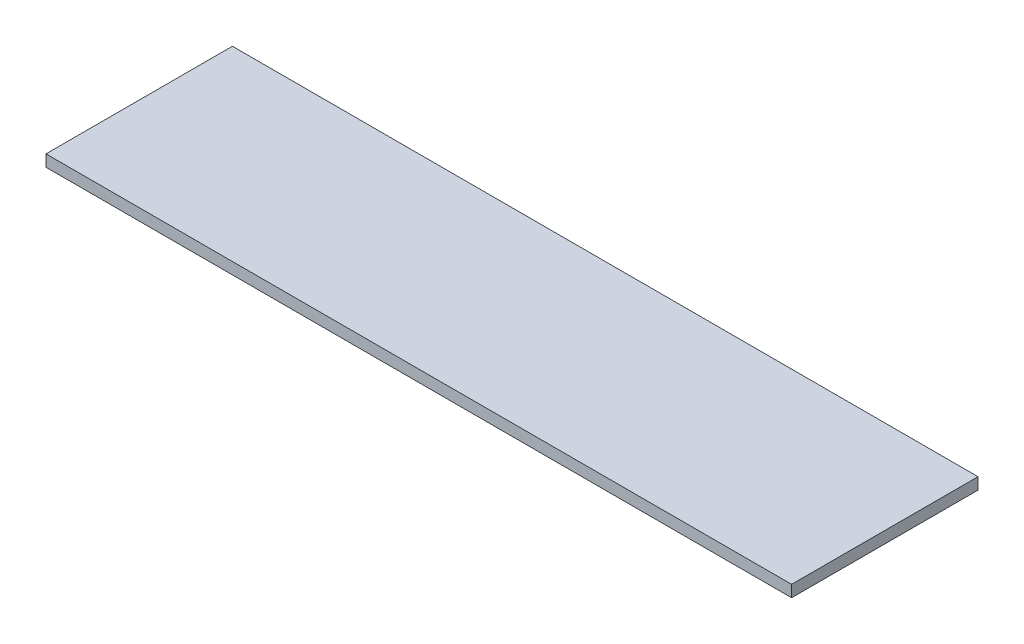
ISO-10303-21;
HEADER;
FILE_DESCRIPTION(('STEP AP214'),'2;1');
FILE_NAME('part.step','',(''),(''),'','','');
FILE_SCHEMA(('AUTOMOTIVE_DESIGN { 1 0 10303 214 1 1 1 1 }'));
ENDSEC;
DATA;
#1=APPLICATION_CONTEXT('core data for automotive mechanical design processes');
#2=APPLICATION_PROTOCOL_DEFINITION('international standard','automotive_design',2000,#1);
#3=PRODUCT_CONTEXT('',#1,'mechanical');
#4=PRODUCT('Part','Part','',(#3));
#5=PRODUCT_RELATED_PRODUCT_CATEGORY('part','',(#4));
#6=PRODUCT_DEFINITION_FORMATION('','',#4);
#7=PRODUCT_DEFINITION_CONTEXT('part definition',#1,'design');
#8=PRODUCT_DEFINITION('design','',#6,#7);
#9=PRODUCT_DEFINITION_SHAPE('','',#8);
#10=(LENGTH_UNIT() NAMED_UNIT(*) SI_UNIT(.MILLI.,.METRE.));
#11=(NAMED_UNIT(*) PLANE_ANGLE_UNIT() SI_UNIT($,.RADIAN.));
#12=(NAMED_UNIT(*) SI_UNIT($,.STERADIAN.) SOLID_ANGLE_UNIT());
#13=UNCERTAINTY_MEASURE_WITH_UNIT(LENGTH_MEASURE(1.E-05),#10,'distance_accuracy_value','');
#14=(GEOMETRIC_REPRESENTATION_CONTEXT(3) GLOBAL_UNCERTAINTY_ASSIGNED_CONTEXT((#13)) GLOBAL_UNIT_ASSIGNED_CONTEXT((#10,
#11,#12)) REPRESENTATION_CONTEXT('',''));
#15=CARTESIAN_POINT('',(0.,0.,0.));
#16=DIRECTION('',(0.,0.,1.));
#17=DIRECTION('',(1.,0.,0.));
#18=AXIS2_PLACEMENT_3D('',#15,#16,#17);
#19=CARTESIAN_POINT('',(0.,1.5875,0.));
#20=DIRECTION('',(1.,0.,0.));
#21=DIRECTION('',(0.,0.,-1.));
#22=AXIS2_PLACEMENT_3D('',#19,#20,#21);
#23=PLANE('',#22);
#24=DIRECTION('',(0.,0.,1.));
#25=VECTOR('',#24,1.);
#26=CARTESIAN_POINT('',(0.,0.,0.));
#27=LINE('',#26,#25);
#28=CARTESIAN_POINT('',(0.,0.,-25.4));
#29=VERTEX_POINT('',#28);
#30=CARTESIAN_POINT('',(0.,0.,0.));
#31=VERTEX_POINT('',#30);
#32=EDGE_CURVE('E100',#29,#31,#27,.T.);
#33=ORIENTED_EDGE('',*,*,#32,.T.);
#34=DIRECTION('',(0.,-1.,0.));
#35=VECTOR('',#34,1.);
#36=CARTESIAN_POINT('',(0.,1.5875,0.));
#37=LINE('',#36,#35);
#38=CARTESIAN_POINT('',(0.,1.5875,0.));
#39=VERTEX_POINT('',#38);
#40=EDGE_CURVE('E11',#39,#31,#37,.T.);
#41=ORIENTED_EDGE('',*,*,#40,.F.);
#42=DIRECTION('',(0.,0.,1.));
#43=VECTOR('',#42,1.);
#44=CARTESIAN_POINT('',(0.,1.5875,0.));
#45=LINE('',#44,#43);
#46=CARTESIAN_POINT('',(0.,1.5875,-25.4));
#47=VERTEX_POINT('',#46);
#48=EDGE_CURVE('E88',#47,#39,#45,.T.);
#49=ORIENTED_EDGE('',*,*,#48,.F.);
#50=DIRECTION('',(0.,-1.,0.));
#51=VECTOR('',#50,1.);
#52=CARTESIAN_POINT('',(0.,1.5875,-25.4));
#53=LINE('',#52,#51);
#54=EDGE_CURVE('E96',#47,#29,#53,.T.);
#55=ORIENTED_EDGE('',*,*,#54,.T.);
#56=EDGE_LOOP('',(#33,#41,#49,#55));
#57=FACE_BOUND('',#56,.T.);
#58=ADVANCED_FACE('F37',(#57),#23,.F.);
#59=CARTESIAN_POINT('',(0.,1.5875,0.));
#60=DIRECTION('',(0.,0.,-1.));
#61=DIRECTION('',(-1.,0.,0.));
#62=AXIS2_PLACEMENT_3D('',#59,#60,#61);
#63=PLANE('',#62);
#64=DIRECTION('',(1.,0.,0.));
#65=VECTOR('',#64,1.);
#66=CARTESIAN_POINT('',(0.,0.,0.));
#67=LINE('',#66,#65);
#68=CARTESIAN_POINT('',(101.6,0.,0.));
#69=VERTEX_POINT('',#68);
#70=EDGE_CURVE('E92',#31,#69,#67,.T.);
#71=ORIENTED_EDGE('',*,*,#70,.T.);
#72=DIRECTION('',(0.,-1.,0.));
#73=VECTOR('',#72,1.);
#74=CARTESIAN_POINT('',(101.6,1.5875,0.));
#75=LINE('',#74,#73);
#76=CARTESIAN_POINT('',(101.6,1.5875,0.));
#77=VERTEX_POINT('',#76);
#78=EDGE_CURVE('E45',#77,#69,#75,.T.);
#79=ORIENTED_EDGE('',*,*,#78,.F.);
#80=DIRECTION('',(1.,0.,0.));
#81=VECTOR('',#80,1.);
#82=CARTESIAN_POINT('',(0.,1.5875,0.));
#83=LINE('',#82,#81);
#84=EDGE_CURVE('E83',#39,#77,#83,.T.);
#85=ORIENTED_EDGE('',*,*,#84,.F.);
#86=ORIENTED_EDGE('',*,*,#40,.T.);
#87=EDGE_LOOP('',(#71,#79,#85,#86));
#88=FACE_BOUND('',#87,.T.);
#89=ADVANCED_FACE('F91',(#88),#63,.F.);
#90=CARTESIAN_POINT('',(101.6,1.5875,0.));
#91=DIRECTION('',(-1.,0.,0.));
#92=DIRECTION('',(0.,0.,1.));
#93=AXIS2_PLACEMENT_3D('',#90,#91,#92);
#94=PLANE('',#93);
#95=DIRECTION('',(0.,0.,-1.));
#96=VECTOR('',#95,1.);
#97=CARTESIAN_POINT('',(101.6,0.,0.));
#98=LINE('',#97,#96);
#99=CARTESIAN_POINT('',(101.6,0.,-25.4));
#100=VERTEX_POINT('',#99);
#101=EDGE_CURVE('E70',#69,#100,#98,.T.);
#102=ORIENTED_EDGE('',*,*,#101,.T.);
#103=DIRECTION('',(0.,-1.,0.));
#104=VECTOR('',#103,1.);
#105=CARTESIAN_POINT('',(101.6,1.5875,-25.4));
#106=LINE('',#105,#104);
#107=CARTESIAN_POINT('',(101.6,1.5875,-25.4));
#108=VERTEX_POINT('',#107);
#109=EDGE_CURVE('E93',#108,#100,#106,.T.);
#110=ORIENTED_EDGE('',*,*,#109,.F.);
#111=DIRECTION('',(0.,0.,-1.));
#112=VECTOR('',#111,1.);
#113=CARTESIAN_POINT('',(101.6,1.5875,0.));
#114=LINE('',#113,#112);
#115=EDGE_CURVE('E86',#77,#108,#114,.T.);
#116=ORIENTED_EDGE('',*,*,#115,.F.);
#117=ORIENTED_EDGE('',*,*,#78,.T.);
#118=EDGE_LOOP('',(#102,#110,#116,#117));
#119=FACE_BOUND('',#118,.T.);
#120=ADVANCED_FACE('F94',(#119),#94,.F.);
#121=CARTESIAN_POINT('',(0.,1.5875,-25.4));
#122=DIRECTION('',(0.,0.,1.));
#123=DIRECTION('',(1.,0.,0.));
#124=AXIS2_PLACEMENT_3D('',#121,#122,#123);
#125=PLANE('',#124);
#126=DIRECTION('',(-1.,0.,0.));
#127=VECTOR('',#126,1.);
#128=CARTESIAN_POINT('',(0.,0.,-25.4));
#129=LINE('',#128,#127);
#130=EDGE_CURVE('E76',#100,#29,#129,.T.);
#131=ORIENTED_EDGE('',*,*,#130,.T.);
#132=ORIENTED_EDGE('',*,*,#54,.F.);
#133=DIRECTION('',(-1.,0.,0.));
#134=VECTOR('',#133,1.);
#135=CARTESIAN_POINT('',(0.,1.5875,-25.4));
#136=LINE('',#135,#134);
#137=EDGE_CURVE('E53',#108,#47,#136,.T.);
#138=ORIENTED_EDGE('',*,*,#137,.F.);
#139=ORIENTED_EDGE('',*,*,#109,.T.);
#140=EDGE_LOOP('',(#131,#132,#138,#139));
#141=FACE_BOUND('',#140,.T.);
#142=ADVANCED_FACE('F107',(#141),#125,.F.);
#143=CARTESIAN_POINT('',(0.,1.5875,0.));
#144=DIRECTION('',(0.,-1.,0.));
#145=DIRECTION('',(0.,0.,-1.));
#146=AXIS2_PLACEMENT_3D('',#143,#144,#145);
#147=PLANE('',#146);
#148=ORIENTED_EDGE('',*,*,#48,.T.);
#149=ORIENTED_EDGE('',*,*,#84,.T.);
#150=ORIENTED_EDGE('',*,*,#115,.T.);
#151=ORIENTED_EDGE('',*,*,#137,.T.);
#152=EDGE_LOOP('',(#148,#149,#150,#151));
#153=FACE_BOUND('',#152,.T.);
#154=ADVANCED_FACE('F84',(#153),#147,.F.);
#155=CARTESIAN_POINT('',(0.,0.,0.));
#156=DIRECTION('',(0.,-1.,0.));
#157=DIRECTION('',(0.,0.,-1.));
#158=AXIS2_PLACEMENT_3D('',#155,#156,#157);
#159=PLANE('',#158);
#160=ORIENTED_EDGE('',*,*,#32,.F.);
#161=ORIENTED_EDGE('',*,*,#130,.F.);
#162=ORIENTED_EDGE('',*,*,#101,.F.);
#163=ORIENTED_EDGE('',*,*,#70,.F.);
#164=EDGE_LOOP('',(#160,#161,#162,#163));
#165=FACE_BOUND('',#164,.T.);
#166=ADVANCED_FACE('F110',(#165),#159,.T.);
#167=CLOSED_SHELL('',(#58,#89,#120,#142,#154,#166));
#168=MANIFOLD_SOLID_BREP('B2',#167);
#169=ADVANCED_BREP_SHAPE_REPRESENTATION('',(#18,#168),#14);
#170=SHAPE_DEFINITION_REPRESENTATION(#9,#169);
ENDSEC;
END-ISO-10303-21;
